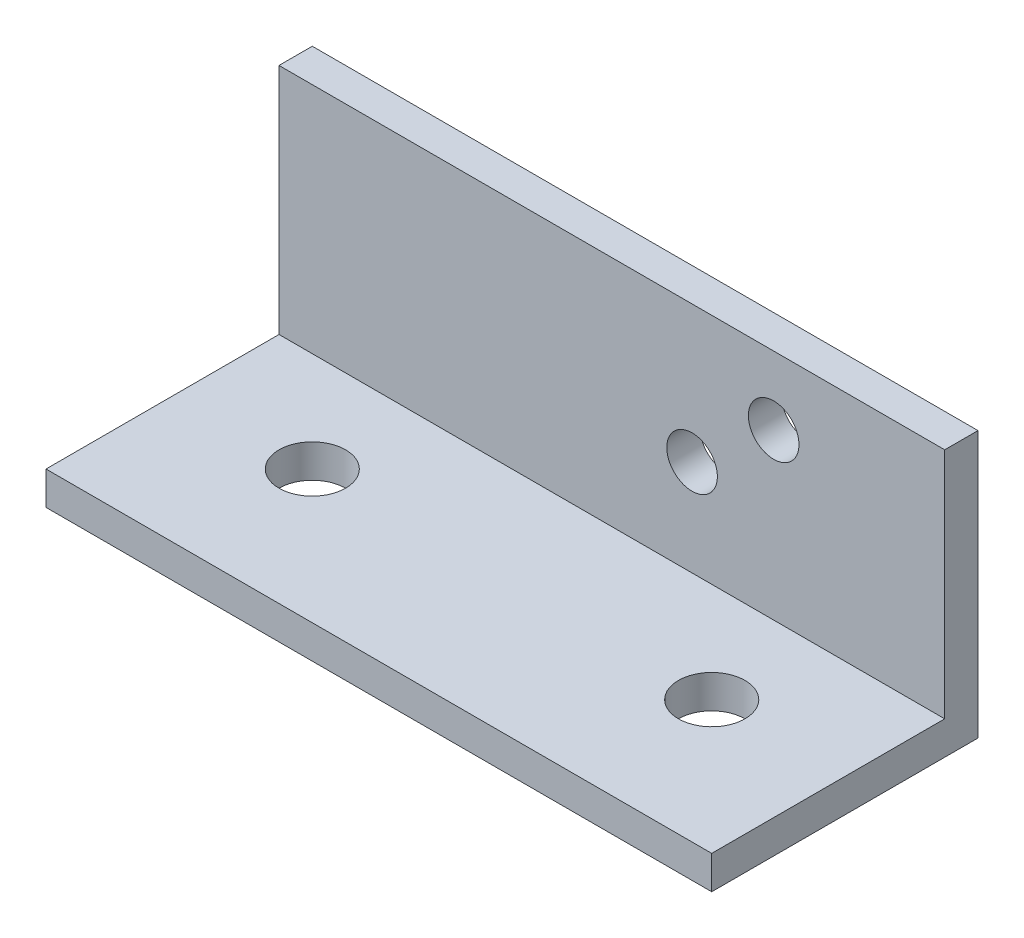
ISO-10303-21;
HEADER;
FILE_DESCRIPTION(('STEP AP214'),'2;1');
FILE_NAME('part.step','',(''),(''),'','','');
FILE_SCHEMA(('AUTOMOTIVE_DESIGN { 1 0 10303 214 1 1 1 1 }'));
ENDSEC;
DATA;
#1=APPLICATION_CONTEXT('core data for automotive mechanical design processes');
#2=APPLICATION_PROTOCOL_DEFINITION('international standard','automotive_design',2000,#1);
#3=PRODUCT_CONTEXT('',#1,'mechanical');
#4=PRODUCT('Part','Part','',(#3));
#5=PRODUCT_RELATED_PRODUCT_CATEGORY('part','',(#4));
#6=PRODUCT_DEFINITION_FORMATION('','',#4);
#7=PRODUCT_DEFINITION_CONTEXT('part definition',#1,'design');
#8=PRODUCT_DEFINITION('design','',#6,#7);
#9=PRODUCT_DEFINITION_SHAPE('','',#8);
#10=(LENGTH_UNIT() NAMED_UNIT(*) SI_UNIT(.MILLI.,.METRE.));
#11=(NAMED_UNIT(*) PLANE_ANGLE_UNIT() SI_UNIT($,.RADIAN.));
#12=(NAMED_UNIT(*) SI_UNIT($,.STERADIAN.) SOLID_ANGLE_UNIT());
#13=UNCERTAINTY_MEASURE_WITH_UNIT(LENGTH_MEASURE(1.E-05),#10,'distance_accuracy_value','');
#14=(GEOMETRIC_REPRESENTATION_CONTEXT(3) GLOBAL_UNCERTAINTY_ASSIGNED_CONTEXT((#13)) GLOBAL_UNIT_ASSIGNED_CONTEXT((#10,
#11,#12)) REPRESENTATION_CONTEXT('',''));
#15=CARTESIAN_POINT('',(0.,0.,0.));
#16=DIRECTION('',(0.,0.,1.));
#17=DIRECTION('',(1.,0.,0.));
#18=AXIS2_PLACEMENT_3D('',#15,#16,#17);
#19=CARTESIAN_POINT('',(0.,3.175,0.));
#20=DIRECTION('',(1.,0.,0.));
#21=DIRECTION('',(0.,0.,-1.));
#22=AXIS2_PLACEMENT_3D('',#19,#20,#21);
#23=PLANE('',#22);
#24=DIRECTION('',(0.,0.,1.));
#25=VECTOR('',#24,1.);
#26=CARTESIAN_POINT('',(0.,0.,0.));
#27=LINE('',#26,#25);
#28=CARTESIAN_POINT('',(0.,0.,0.));
#29=VERTEX_POINT('',#28);
#30=CARTESIAN_POINT('',(0.,0.,25.4));
#31=VERTEX_POINT('',#30);
#32=EDGE_CURVE('E97',#29,#31,#27,.T.);
#33=ORIENTED_EDGE('',*,*,#32,.T.);
#34=DIRECTION('',(0.,-1.,0.));
#35=VECTOR('',#34,1.);
#36=CARTESIAN_POINT('',(0.,3.175,25.4));
#37=LINE('',#36,#35);
#38=CARTESIAN_POINT('',(0.,3.175,25.4));
#39=VERTEX_POINT('',#38);
#40=EDGE_CURVE('E11',#39,#31,#37,.T.);
#41=ORIENTED_EDGE('',*,*,#40,.F.);
#42=DIRECTION('',(0.,0.,1.));
#43=VECTOR('',#42,1.);
#44=CARTESIAN_POINT('',(0.,3.175,0.));
#45=LINE('',#44,#43);
#46=CARTESIAN_POINT('',(0.,3.175,3.175));
#47=VERTEX_POINT('',#46);
#48=EDGE_CURVE('E90',#47,#39,#45,.T.);
#49=ORIENTED_EDGE('',*,*,#48,.F.);
#50=DIRECTION('',(0.,-1.,0.));
#51=VECTOR('',#50,1.);
#52=CARTESIAN_POINT('',(0.,25.4,3.175));
#53=LINE('',#52,#51);
#54=CARTESIAN_POINT('',(0.,25.4,3.175));
#55=VERTEX_POINT('',#54);
#56=EDGE_CURVE('E105',#55,#47,#53,.T.);
#57=ORIENTED_EDGE('',*,*,#56,.F.);
#58=DIRECTION('',(0.,0.,1.));
#59=VECTOR('',#58,1.);
#60=CARTESIAN_POINT('',(0.,25.4,0.));
#61=LINE('',#60,#59);
#62=CARTESIAN_POINT('',(0.,25.4,0.));
#63=VERTEX_POINT('',#62);
#64=EDGE_CURVE('E100',#63,#55,#61,.T.);
#65=ORIENTED_EDGE('',*,*,#64,.F.);
#66=DIRECTION('',(0.,-1.,0.));
#67=VECTOR('',#66,1.);
#68=CARTESIAN_POINT('',(0.,3.175,0.));
#69=LINE('',#68,#67);
#70=EDGE_CURVE('E83',#63,#29,#69,.T.);
#71=ORIENTED_EDGE('',*,*,#70,.T.);
#72=EDGE_LOOP('',(#33,#41,#49,#57,#65,#71));
#73=FACE_BOUND('',#72,.T.);
#74=ADVANCED_FACE('F39',(#73),#23,.F.);
#75=CARTESIAN_POINT('',(0.,3.175,25.4));
#76=DIRECTION('',(0.,0.,-1.));
#77=DIRECTION('',(-1.,0.,0.));
#78=AXIS2_PLACEMENT_3D('',#75,#76,#77);
#79=PLANE('',#78);
#80=DIRECTION('',(1.,0.,0.));
#81=VECTOR('',#80,1.);
#82=CARTESIAN_POINT('',(0.,0.,25.4));
#83=LINE('',#82,#81);
#84=CARTESIAN_POINT('',(63.5,0.,25.4));
#85=VERTEX_POINT('',#84);
#86=EDGE_CURVE('E104',#31,#85,#83,.T.);
#87=ORIENTED_EDGE('',*,*,#86,.T.);
#88=DIRECTION('',(0.,-1.,0.));
#89=VECTOR('',#88,1.);
#90=CARTESIAN_POINT('',(63.5,3.175,25.4));
#91=LINE('',#90,#89);
#92=CARTESIAN_POINT('',(63.5,3.175,25.4));
#93=VERTEX_POINT('',#92);
#94=EDGE_CURVE('E46',#93,#85,#91,.T.);
#95=ORIENTED_EDGE('',*,*,#94,.F.);
#96=DIRECTION('',(1.,0.,0.));
#97=VECTOR('',#96,1.);
#98=CARTESIAN_POINT('',(0.,3.175,25.4));
#99=LINE('',#98,#97);
#100=EDGE_CURVE('E59',#39,#93,#99,.T.);
#101=ORIENTED_EDGE('',*,*,#100,.F.);
#102=ORIENTED_EDGE('',*,*,#40,.T.);
#103=EDGE_LOOP('',(#87,#95,#101,#102));
#104=FACE_BOUND('',#103,.T.);
#105=ADVANCED_FACE('F121',(#104),#79,.F.);
#106=CARTESIAN_POINT('',(63.5,3.175,0.));
#107=DIRECTION('',(-1.,0.,0.));
#108=DIRECTION('',(0.,0.,1.));
#109=AXIS2_PLACEMENT_3D('',#106,#107,#108);
#110=PLANE('',#109);
#111=DIRECTION('',(0.,0.,-1.));
#112=VECTOR('',#111,1.);
#113=CARTESIAN_POINT('',(63.5,0.,0.));
#114=LINE('',#113,#112);
#115=CARTESIAN_POINT('',(63.5,0.,0.));
#116=VERTEX_POINT('',#115);
#117=EDGE_CURVE('E91',#85,#116,#114,.T.);
#118=ORIENTED_EDGE('',*,*,#117,.T.);
#119=DIRECTION('',(0.,-1.,0.));
#120=VECTOR('',#119,1.);
#121=CARTESIAN_POINT('',(63.5,3.175,0.));
#122=LINE('',#121,#120);
#123=CARTESIAN_POINT('',(63.5,25.4,0.));
#124=VERTEX_POINT('',#123);
#125=EDGE_CURVE('E86',#124,#116,#122,.T.);
#126=ORIENTED_EDGE('',*,*,#125,.F.);
#127=DIRECTION('',(0.,0.,-1.));
#128=VECTOR('',#127,1.);
#129=CARTESIAN_POINT('',(63.5,25.4,0.));
#130=LINE('',#129,#128);
#131=CARTESIAN_POINT('',(63.5,25.4,3.175));
#132=VERTEX_POINT('',#131);
#133=EDGE_CURVE('E136',#132,#124,#130,.T.);
#134=ORIENTED_EDGE('',*,*,#133,.F.);
#135=DIRECTION('',(0.,-1.,0.));
#136=VECTOR('',#135,1.);
#137=CARTESIAN_POINT('',(63.5,25.4,3.175));
#138=LINE('',#137,#136);
#139=CARTESIAN_POINT('',(63.5,3.175,3.175));
#140=VERTEX_POINT('',#139);
#141=EDGE_CURVE('E109',#132,#140,#138,.T.);
#142=ORIENTED_EDGE('',*,*,#141,.T.);
#143=DIRECTION('',(0.,0.,-1.));
#144=VECTOR('',#143,1.);
#145=CARTESIAN_POINT('',(63.5,3.175,0.));
#146=LINE('',#145,#144);
#147=EDGE_CURVE('E101',#93,#140,#146,.T.);
#148=ORIENTED_EDGE('',*,*,#147,.F.);
#149=ORIENTED_EDGE('',*,*,#94,.T.);
#150=EDGE_LOOP('',(#118,#126,#134,#142,#148,#149));
#151=FACE_BOUND('',#150,.T.);
#152=ADVANCED_FACE('F118',(#151),#110,.F.);
#153=CARTESIAN_POINT('',(0.,3.175,0.));
#154=DIRECTION('',(0.,0.,1.));
#155=DIRECTION('',(1.,0.,0.));
#156=AXIS2_PLACEMENT_3D('',#153,#154,#155);
#157=PLANE('',#156);
#158=CARTESIAN_POINT('',(47.1846454612127,18.8692778855847,0.));
#159=DIRECTION('',(0.,0.,-1.));
#160=DIRECTION('',(-1.,0.,0.));
#161=AXIS2_PLACEMENT_3D('',#158,#159,#160);
#162=CIRCLE('',#161,2.413);
#163=CARTESIAN_POINT('',(44.7716454612127,18.8692778855847,0.));
#164=VERTEX_POINT('',#163);
#165=EDGE_CURVE('E234',#164,#164,#162,.T.);
#166=ORIENTED_EDGE('',*,*,#165,.F.);
#167=EDGE_LOOP('',(#166));
#168=FACE_BOUND('',#167,.T.);
#169=CARTESIAN_POINT('',(39.4016339191239,12.3385557711694,0.));
#170=DIRECTION('',(0.,0.,-1.));
#171=DIRECTION('',(-1.,0.,0.));
#172=AXIS2_PLACEMENT_3D('',#169,#170,#171);
#173=CIRCLE('',#172,2.41299999999999);
#174=CARTESIAN_POINT('',(36.9886339191239,12.3385557711694,0.));
#175=VERTEX_POINT('',#174);
#176=EDGE_CURVE('E235',#175,#175,#173,.T.);
#177=ORIENTED_EDGE('',*,*,#176,.F.);
#178=EDGE_LOOP('',(#177));
#179=FACE_BOUND('',#178,.T.);
#180=DIRECTION('',(-1.,0.,0.));
#181=VECTOR('',#180,1.);
#182=CARTESIAN_POINT('',(0.,0.,0.));
#183=LINE('',#182,#181);
#184=EDGE_CURVE('E79',#116,#29,#183,.T.);
#185=ORIENTED_EDGE('',*,*,#184,.T.);
#186=ORIENTED_EDGE('',*,*,#70,.F.);
#187=DIRECTION('',(-1.,0.,0.));
#188=VECTOR('',#187,1.);
#189=CARTESIAN_POINT('',(0.,25.4,0.));
#190=LINE('',#189,#188);
#191=EDGE_CURVE('E139',#124,#63,#190,.T.);
#192=ORIENTED_EDGE('',*,*,#191,.F.);
#193=ORIENTED_EDGE('',*,*,#125,.T.);
#194=EDGE_LOOP('',(#185,#186,#192,#193));
#195=FACE_BOUND('',#194,.T.);
#196=ADVANCED_FACE('F81',(#168,#179,#195),#157,.F.);
#197=CARTESIAN_POINT('',(0.,3.175,0.));
#198=DIRECTION('',(0.,1.,0.));
#199=DIRECTION('',(0.,0.,1.));
#200=AXIS2_PLACEMENT_3D('',#197,#198,#199);
#201=PLANE('',#200);
#202=CARTESIAN_POINT('',(50.8,3.175,12.7));
#203=DIRECTION('',(0.,1.,0.));
#204=DIRECTION('',(0.,0.,1.));
#205=AXIS2_PLACEMENT_3D('',#202,#203,#204);
#206=CIRCLE('',#205,3.175);
#207=CARTESIAN_POINT('',(50.8,3.175,15.875));
#208=VERTEX_POINT('',#207);
#209=EDGE_CURVE('E245',#208,#208,#206,.T.);
#210=ORIENTED_EDGE('',*,*,#209,.F.);
#211=EDGE_LOOP('',(#210));
#212=FACE_BOUND('',#211,.T.);
#213=CARTESIAN_POINT('',(12.7,3.175,12.7));
#214=DIRECTION('',(0.,1.,0.));
#215=DIRECTION('',(0.,0.,1.));
#216=AXIS2_PLACEMENT_3D('',#213,#214,#215);
#217=CIRCLE('',#216,3.175);
#218=CARTESIAN_POINT('',(12.7,3.175,15.875));
#219=VERTEX_POINT('',#218);
#220=EDGE_CURVE('E144',#219,#219,#217,.T.);
#221=ORIENTED_EDGE('',*,*,#220,.F.);
#222=EDGE_LOOP('',(#221));
#223=FACE_BOUND('',#222,.T.);
#224=DIRECTION('',(1.,0.,0.));
#225=VECTOR('',#224,1.);
#226=CARTESIAN_POINT('',(0.,3.175,3.175));
#227=LINE('',#226,#225);
#228=EDGE_CURVE('E53',#47,#140,#227,.T.);
#229=ORIENTED_EDGE('',*,*,#228,.F.);
#230=ORIENTED_EDGE('',*,*,#48,.T.);
#231=ORIENTED_EDGE('',*,*,#100,.T.);
#232=ORIENTED_EDGE('',*,*,#147,.T.);
#233=EDGE_LOOP('',(#229,#230,#231,#232));
#234=FACE_BOUND('',#233,.T.);
#235=ADVANCED_FACE('F149',(#212,#223,#234),#201,.T.);
#236=CARTESIAN_POINT('',(0.,0.,0.));
#237=DIRECTION('',(0.,1.,0.));
#238=DIRECTION('',(0.,0.,1.));
#239=AXIS2_PLACEMENT_3D('',#236,#237,#238);
#240=PLANE('',#239);
#241=CARTESIAN_POINT('',(50.8,0.,12.7));
#242=DIRECTION('',(0.,1.,0.));
#243=DIRECTION('',(0.,0.,1.));
#244=AXIS2_PLACEMENT_3D('',#241,#242,#243);
#245=CIRCLE('',#244,3.175);
#246=CARTESIAN_POINT('',(50.8,0.,15.875));
#247=VERTEX_POINT('',#246);
#248=EDGE_CURVE('E141',#247,#247,#245,.T.);
#249=ORIENTED_EDGE('',*,*,#248,.T.);
#250=EDGE_LOOP('',(#249));
#251=FACE_BOUND('',#250,.T.);
#252=CARTESIAN_POINT('',(12.7,0.,12.7));
#253=DIRECTION('',(0.,1.,0.));
#254=DIRECTION('',(0.,0.,1.));
#255=AXIS2_PLACEMENT_3D('',#252,#253,#254);
#256=CIRCLE('',#255,3.175);
#257=CARTESIAN_POINT('',(12.7,0.,15.875));
#258=VERTEX_POINT('',#257);
#259=EDGE_CURVE('E247',#258,#258,#256,.T.);
#260=ORIENTED_EDGE('',*,*,#259,.T.);
#261=EDGE_LOOP('',(#260));
#262=FACE_BOUND('',#261,.T.);
#263=ORIENTED_EDGE('',*,*,#32,.F.);
#264=ORIENTED_EDGE('',*,*,#184,.F.);
#265=ORIENTED_EDGE('',*,*,#117,.F.);
#266=ORIENTED_EDGE('',*,*,#86,.F.);
#267=EDGE_LOOP('',(#263,#264,#265,#266));
#268=FACE_BOUND('',#267,.T.);
#269=ADVANCED_FACE('F103',(#251,#262,#268),#240,.F.);
#270=CARTESIAN_POINT('',(0.,25.4,3.175));
#271=DIRECTION('',(0.,0.,-1.));
#272=DIRECTION('',(-1.,0.,0.));
#273=AXIS2_PLACEMENT_3D('',#270,#271,#272);
#274=PLANE('',#273);
#275=CARTESIAN_POINT('',(47.1846454612127,18.8692778855847,3.175));
#276=DIRECTION('',(0.,0.,-1.));
#277=DIRECTION('',(-1.,0.,0.));
#278=AXIS2_PLACEMENT_3D('',#275,#276,#277);
#279=CIRCLE('',#278,2.413);
#280=CARTESIAN_POINT('',(44.7716454612127,18.8692778855847,3.175));
#281=VERTEX_POINT('',#280);
#282=EDGE_CURVE('E230',#281,#281,#279,.T.);
#283=ORIENTED_EDGE('',*,*,#282,.T.);
#284=EDGE_LOOP('',(#283));
#285=FACE_BOUND('',#284,.T.);
#286=CARTESIAN_POINT('',(39.4016339191239,12.3385557711694,3.175));
#287=DIRECTION('',(0.,0.,-1.));
#288=DIRECTION('',(-1.,0.,0.));
#289=AXIS2_PLACEMENT_3D('',#286,#287,#288);
#290=CIRCLE('',#289,2.41299999999999);
#291=CARTESIAN_POINT('',(36.9886339191239,12.3385557711694,3.175));
#292=VERTEX_POINT('',#291);
#293=EDGE_CURVE('E233',#292,#292,#290,.T.);
#294=ORIENTED_EDGE('',*,*,#293,.T.);
#295=EDGE_LOOP('',(#294));
#296=FACE_BOUND('',#295,.T.);
#297=ORIENTED_EDGE('',*,*,#228,.T.);
#298=ORIENTED_EDGE('',*,*,#141,.F.);
#299=DIRECTION('',(1.,0.,0.));
#300=VECTOR('',#299,1.);
#301=CARTESIAN_POINT('',(0.,25.4,3.175));
#302=LINE('',#301,#300);
#303=EDGE_CURVE('E130',#55,#132,#302,.T.);
#304=ORIENTED_EDGE('',*,*,#303,.F.);
#305=ORIENTED_EDGE('',*,*,#56,.T.);
#306=EDGE_LOOP('',(#297,#298,#304,#305));
#307=FACE_BOUND('',#306,.T.);
#308=ADVANCED_FACE('F126',(#285,#296,#307),#274,.F.);
#309=CARTESIAN_POINT('',(0.,25.4,0.));
#310=DIRECTION('',(0.,1.,0.));
#311=DIRECTION('',(0.,0.,1.));
#312=AXIS2_PLACEMENT_3D('',#309,#310,#311);
#313=PLANE('',#312);
#314=ORIENTED_EDGE('',*,*,#64,.T.);
#315=ORIENTED_EDGE('',*,*,#303,.T.);
#316=ORIENTED_EDGE('',*,*,#133,.T.);
#317=ORIENTED_EDGE('',*,*,#191,.T.);
#318=EDGE_LOOP('',(#314,#315,#316,#317));
#319=FACE_BOUND('',#318,.T.);
#320=ADVANCED_FACE('F138',(#319),#313,.T.);
#321=CARTESIAN_POINT('',(12.7,0.,12.7));
#322=DIRECTION('',(0.,1.,0.));
#323=DIRECTION('',(0.,0.,1.));
#324=AXIS2_PLACEMENT_3D('',#321,#322,#323);
#325=CYLINDRICAL_SURFACE('',#324,3.175);
#326=ORIENTED_EDGE('',*,*,#259,.F.);
#327=EDGE_LOOP('',(#326));
#328=FACE_BOUND('',#327,.T.);
#329=ORIENTED_EDGE('',*,*,#220,.T.);
#330=EDGE_LOOP('',(#329));
#331=FACE_BOUND('',#330,.T.);
#332=ADVANCED_FACE('F185',(#328,#331),#325,.F.);
#333=CARTESIAN_POINT('',(50.8,0.,12.7));
#334=DIRECTION('',(0.,1.,0.));
#335=DIRECTION('',(0.,0.,1.));
#336=AXIS2_PLACEMENT_3D('',#333,#334,#335);
#337=CYLINDRICAL_SURFACE('',#336,3.175);
#338=ORIENTED_EDGE('',*,*,#248,.F.);
#339=EDGE_LOOP('',(#338));
#340=FACE_BOUND('',#339,.T.);
#341=ORIENTED_EDGE('',*,*,#209,.T.);
#342=EDGE_LOOP('',(#341));
#343=FACE_BOUND('',#342,.T.);
#344=ADVANCED_FACE('F198',(#340,#343),#337,.F.);
#345=CARTESIAN_POINT('',(39.4016339191239,12.3385557711694,3.175));
#346=DIRECTION('',(0.,0.,-1.));
#347=DIRECTION('',(-1.,0.,0.));
#348=AXIS2_PLACEMENT_3D('',#345,#346,#347);
#349=CYLINDRICAL_SURFACE('',#348,2.41299999999999);
#350=ORIENTED_EDGE('',*,*,#293,.F.);
#351=EDGE_LOOP('',(#350));
#352=FACE_BOUND('',#351,.T.);
#353=ORIENTED_EDGE('',*,*,#176,.T.);
#354=EDGE_LOOP('',(#353));
#355=FACE_BOUND('',#354,.T.);
#356=ADVANCED_FACE('F206',(#352,#355),#349,.F.);
#357=CARTESIAN_POINT('',(47.1846454612127,18.8692778855847,3.175));
#358=DIRECTION('',(0.,0.,-1.));
#359=DIRECTION('',(-1.,0.,0.));
#360=AXIS2_PLACEMENT_3D('',#357,#358,#359);
#361=CYLINDRICAL_SURFACE('',#360,2.413);
#362=ORIENTED_EDGE('',*,*,#282,.F.);
#363=EDGE_LOOP('',(#362));
#364=FACE_BOUND('',#363,.T.);
#365=ORIENTED_EDGE('',*,*,#165,.T.);
#366=EDGE_LOOP('',(#365));
#367=FACE_BOUND('',#366,.T.);
#368=ADVANCED_FACE('F214',(#364,#367),#361,.F.);
#369=CLOSED_SHELL('',(#74,#105,#152,#196,#235,#269,#308,#320,#332,#344,#356,#368));
#370=MANIFOLD_SOLID_BREP('B2',#369);
#371=ADVANCED_BREP_SHAPE_REPRESENTATION('',(#18,#370),#14);
#372=SHAPE_DEFINITION_REPRESENTATION(#9,#371);
ENDSEC;
END-ISO-10303-21;
